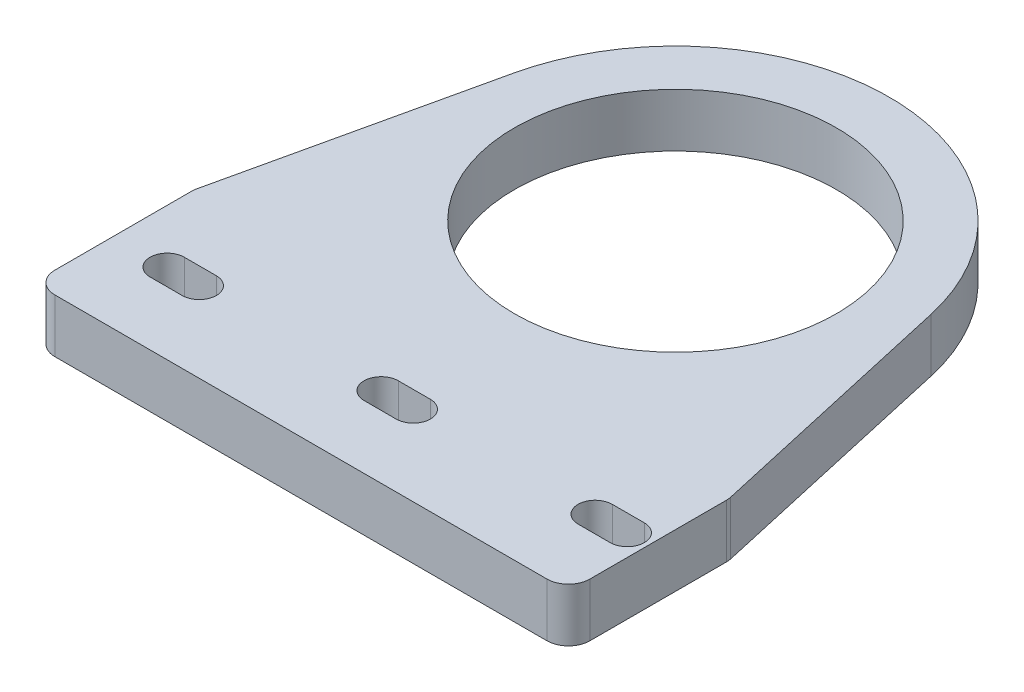
ISO-10303-21;
HEADER;
FILE_DESCRIPTION(('STEP AP214'),'2;1');
FILE_NAME('part.step','',(''),(''),'','','');
FILE_SCHEMA(('AUTOMOTIVE_DESIGN { 1 0 10303 214 1 1 1 1 }'));
ENDSEC;
DATA;
#1=APPLICATION_CONTEXT('core data for automotive mechanical design processes');
#2=APPLICATION_PROTOCOL_DEFINITION('international standard','automotive_design',2000,#1);
#3=PRODUCT_CONTEXT('',#1,'mechanical');
#4=PRODUCT('Part','Part','',(#3));
#5=PRODUCT_RELATED_PRODUCT_CATEGORY('part','',(#4));
#6=PRODUCT_DEFINITION_FORMATION('','',#4);
#7=PRODUCT_DEFINITION_CONTEXT('part definition',#1,'design');
#8=PRODUCT_DEFINITION('design','',#6,#7);
#9=PRODUCT_DEFINITION_SHAPE('','',#8);
#10=(LENGTH_UNIT() NAMED_UNIT(*) SI_UNIT(.MILLI.,.METRE.));
#11=(NAMED_UNIT(*) PLANE_ANGLE_UNIT() SI_UNIT($,.RADIAN.));
#12=(NAMED_UNIT(*) SI_UNIT($,.STERADIAN.) SOLID_ANGLE_UNIT());
#13=UNCERTAINTY_MEASURE_WITH_UNIT(LENGTH_MEASURE(1.E-05),#10,'distance_accuracy_value','');
#14=(GEOMETRIC_REPRESENTATION_CONTEXT(3) GLOBAL_UNCERTAINTY_ASSIGNED_CONTEXT((#13)) GLOBAL_UNIT_ASSIGNED_CONTEXT((#10,
#11,#12)) REPRESENTATION_CONTEXT('',''));
#15=CARTESIAN_POINT('',(0.,0.,0.));
#16=DIRECTION('',(0.,0.,1.));
#17=DIRECTION('',(1.,0.,0.));
#18=AXIS2_PLACEMENT_3D('',#15,#16,#17);
#19=CARTESIAN_POINT('',(-20.,0.,27.5));
#20=DIRECTION('',(0.,1.,0.));
#21=DIRECTION('',(0.,0.,1.));
#22=AXIS2_PLACEMENT_3D('',#19,#20,#21);
#23=CYLINDRICAL_SURFACE('',#22,1.6);
#24=DIRECTION('',(0.,1.,0.));
#25=VECTOR('',#24,1.);
#26=CARTESIAN_POINT('',(-20.,0.,25.9));
#27=LINE('',#26,#25);
#28=CARTESIAN_POINT('',(-20.,0.,25.9));
#29=VERTEX_POINT('',#28);
#30=CARTESIAN_POINT('',(-20.,5.,25.9));
#31=VERTEX_POINT('',#30);
#32=EDGE_CURVE('E244',#29,#31,#27,.T.);
#33=ORIENTED_EDGE('',*,*,#32,.T.);
#34=CARTESIAN_POINT('',(-20.,5.,27.5));
#35=DIRECTION('',(0.,1.,0.));
#36=DIRECTION('',(0.,0.,1.));
#37=AXIS2_PLACEMENT_3D('',#34,#35,#36);
#38=CIRCLE('',#37,1.6);
#39=CARTESIAN_POINT('',(-20.,5.,29.1));
#40=VERTEX_POINT('',#39);
#41=EDGE_CURVE('E334',#31,#40,#38,.T.);
#42=ORIENTED_EDGE('',*,*,#41,.T.);
#43=DIRECTION('',(0.,1.,0.));
#44=VECTOR('',#43,1.);
#45=CARTESIAN_POINT('',(-20.,0.,29.1));
#46=LINE('',#45,#44);
#47=CARTESIAN_POINT('',(-20.,0.,29.1));
#48=VERTEX_POINT('',#47);
#49=EDGE_CURVE('E220',#48,#40,#46,.T.);
#50=ORIENTED_EDGE('',*,*,#49,.F.);
#51=CARTESIAN_POINT('',(-20.,0.,27.5));
#52=DIRECTION('',(0.,1.,0.));
#53=DIRECTION('',(0.,0.,1.));
#54=AXIS2_PLACEMENT_3D('',#51,#52,#53);
#55=CIRCLE('',#54,1.6);
#56=EDGE_CURVE('E234',#29,#48,#55,.T.);
#57=ORIENTED_EDGE('',*,*,#56,.F.);
#58=EDGE_LOOP('',(#33,#42,#50,#57));
#59=FACE_BOUND('',#58,.T.);
#60=ADVANCED_FACE('F65',(#59),#23,.F.);
#61=CARTESIAN_POINT('',(20.,0.,27.5));
#62=DIRECTION('',(0.,1.,0.));
#63=DIRECTION('',(0.,0.,1.));
#64=AXIS2_PLACEMENT_3D('',#61,#62,#63);
#65=CYLINDRICAL_SURFACE('',#64,1.6);
#66=DIRECTION('',(0.,1.,0.));
#67=VECTOR('',#66,1.);
#68=CARTESIAN_POINT('',(20.,0.,25.9));
#69=LINE('',#68,#67);
#70=CARTESIAN_POINT('',(20.,0.,25.9));
#71=VERTEX_POINT('',#70);
#72=CARTESIAN_POINT('',(20.,5.,25.9));
#73=VERTEX_POINT('',#72);
#74=EDGE_CURVE('E283',#71,#73,#69,.T.);
#75=ORIENTED_EDGE('',*,*,#74,.T.);
#76=CARTESIAN_POINT('',(20.,5.,27.5));
#77=DIRECTION('',(0.,1.,0.));
#78=DIRECTION('',(0.,0.,1.));
#79=AXIS2_PLACEMENT_3D('',#76,#77,#78);
#80=CIRCLE('',#79,1.6);
#81=CARTESIAN_POINT('',(20.,5.,29.1));
#82=VERTEX_POINT('',#81);
#83=EDGE_CURVE('E328',#73,#82,#80,.T.);
#84=ORIENTED_EDGE('',*,*,#83,.T.);
#85=DIRECTION('',(0.,1.,0.));
#86=VECTOR('',#85,1.);
#87=CARTESIAN_POINT('',(20.,0.,29.1));
#88=LINE('',#87,#86);
#89=CARTESIAN_POINT('',(20.,0.,29.1));
#90=VERTEX_POINT('',#89);
#91=EDGE_CURVE('E276',#90,#82,#88,.T.);
#92=ORIENTED_EDGE('',*,*,#91,.F.);
#93=CARTESIAN_POINT('',(20.,0.,27.5));
#94=DIRECTION('',(0.,1.,0.));
#95=DIRECTION('',(0.,0.,1.));
#96=AXIS2_PLACEMENT_3D('',#93,#94,#95);
#97=CIRCLE('',#96,1.6);
#98=EDGE_CURVE('E331',#71,#90,#97,.T.);
#99=ORIENTED_EDGE('',*,*,#98,.F.);
#100=EDGE_LOOP('',(#75,#84,#92,#99));
#101=FACE_BOUND('',#100,.T.);
#102=ADVANCED_FACE('F444',(#101),#65,.F.);
#103=CARTESIAN_POINT('',(0.,0.,27.5));
#104=DIRECTION('',(0.,1.,0.));
#105=DIRECTION('',(0.,0.,1.));
#106=AXIS2_PLACEMENT_3D('',#103,#104,#105);
#107=CYLINDRICAL_SURFACE('',#106,1.6);
#108=DIRECTION('',(0.,1.,0.));
#109=VECTOR('',#108,1.);
#110=CARTESIAN_POINT('',(0.,0.,25.9));
#111=LINE('',#110,#109);
#112=CARTESIAN_POINT('',(0.,0.,25.9));
#113=VERTEX_POINT('',#112);
#114=CARTESIAN_POINT('',(0.,5.,25.9));
#115=VERTEX_POINT('',#114);
#116=EDGE_CURVE('E257',#113,#115,#111,.T.);
#117=ORIENTED_EDGE('',*,*,#116,.T.);
#118=CARTESIAN_POINT('',(0.,5.,27.5));
#119=DIRECTION('',(0.,1.,0.));
#120=DIRECTION('',(0.,0.,1.));
#121=AXIS2_PLACEMENT_3D('',#118,#119,#120);
#122=CIRCLE('',#121,1.6);
#123=CARTESIAN_POINT('',(0.,5.,29.1));
#124=VERTEX_POINT('',#123);
#125=EDGE_CURVE('E324',#115,#124,#122,.T.);
#126=ORIENTED_EDGE('',*,*,#125,.T.);
#127=DIRECTION('',(0.,1.,0.));
#128=VECTOR('',#127,1.);
#129=CARTESIAN_POINT('',(0.,0.,29.1));
#130=LINE('',#129,#128);
#131=CARTESIAN_POINT('',(0.,0.,29.1));
#132=VERTEX_POINT('',#131);
#133=EDGE_CURVE('E250',#132,#124,#130,.T.);
#134=ORIENTED_EDGE('',*,*,#133,.F.);
#135=CARTESIAN_POINT('',(0.,0.,27.5));
#136=DIRECTION('',(0.,1.,0.));
#137=DIRECTION('',(0.,0.,1.));
#138=AXIS2_PLACEMENT_3D('',#135,#136,#137);
#139=CIRCLE('',#138,1.6);
#140=EDGE_CURVE('E325',#113,#132,#139,.T.);
#141=ORIENTED_EDGE('',*,*,#140,.F.);
#142=EDGE_LOOP('',(#117,#126,#134,#141));
#143=FACE_BOUND('',#142,.T.);
#144=ADVANCED_FACE('F451',(#143),#107,.F.);
#145=CARTESIAN_POINT('',(-25.,0.,20.));
#146=DIRECTION('',(-1.,0.,0.));
#147=DIRECTION('',(0.,0.,1.));
#148=AXIS2_PLACEMENT_3D('',#145,#146,#147);
#149=PLANE('',#148);
#150=DIRECTION('',(0.,0.,1.));
#151=VECTOR('',#150,1.);
#152=CARTESIAN_POINT('',(-25.,5.,20.));
#153=LINE('',#152,#151);
#154=CARTESIAN_POINT('',(-25.,5.,20.2222222222222));
#155=VERTEX_POINT('',#154);
#156=CARTESIAN_POINT('',(-25.,5.,33.));
#157=VERTEX_POINT('',#156);
#158=EDGE_CURVE('E338',#155,#157,#153,.T.);
#159=ORIENTED_EDGE('',*,*,#158,.F.);
#160=DIRECTION('',(0.,1.,0.));
#161=VECTOR('',#160,1.);
#162=CARTESIAN_POINT('',(-25.,0.,20.2222222222222));
#163=LINE('',#162,#161);
#164=CARTESIAN_POINT('',(-25.,0.,20.2222222222222));
#165=VERTEX_POINT('',#164);
#166=EDGE_CURVE('E372',#155,#165,#163,.F.);
#167=ORIENTED_EDGE('',*,*,#166,.T.);
#168=DIRECTION('',(0.,0.,1.));
#169=VECTOR('',#168,1.);
#170=CARTESIAN_POINT('',(-25.,0.,20.));
#171=LINE('',#170,#169);
#172=CARTESIAN_POINT('',(-25.,0.,33.));
#173=VERTEX_POINT('',#172);
#174=EDGE_CURVE('E341',#165,#173,#171,.T.);
#175=ORIENTED_EDGE('',*,*,#174,.T.);
#176=DIRECTION('',(0.,1.,0.));
#177=VECTOR('',#176,1.);
#178=CARTESIAN_POINT('',(-25.,0.,33.));
#179=LINE('',#178,#177);
#180=EDGE_CURVE('E369',#173,#157,#179,.T.);
#181=ORIENTED_EDGE('',*,*,#180,.T.);
#182=EDGE_LOOP('',(#159,#167,#175,#181));
#183=FACE_BOUND('',#182,.T.);
#184=ADVANCED_FACE('F416',(#183),#149,.T.);
#185=CARTESIAN_POINT('',(25.,0.,20.));
#186=DIRECTION('',(1.,0.,0.));
#187=DIRECTION('',(0.,0.,-1.));
#188=AXIS2_PLACEMENT_3D('',#185,#186,#187);
#189=PLANE('',#188);
#190=DIRECTION('',(0.,0.,-1.));
#191=VECTOR('',#190,1.);
#192=CARTESIAN_POINT('',(25.,0.,20.));
#193=LINE('',#192,#191);
#194=CARTESIAN_POINT('',(25.,0.,33.));
#195=VERTEX_POINT('',#194);
#196=CARTESIAN_POINT('',(25.,0.,20.2222222222222));
#197=VERTEX_POINT('',#196);
#198=EDGE_CURVE('E348',#195,#197,#193,.T.);
#199=ORIENTED_EDGE('',*,*,#198,.T.);
#200=DIRECTION('',(0.,1.,0.));
#201=VECTOR('',#200,1.);
#202=CARTESIAN_POINT('',(25.,0.,20.2222222222222));
#203=LINE('',#202,#201);
#204=CARTESIAN_POINT('',(25.,5.,20.2222222222222));
#205=VERTEX_POINT('',#204);
#206=EDGE_CURVE('E73',#197,#205,#203,.T.);
#207=ORIENTED_EDGE('',*,*,#206,.T.);
#208=DIRECTION('',(0.,0.,-1.));
#209=VECTOR('',#208,1.);
#210=CARTESIAN_POINT('',(25.,5.,20.));
#211=LINE('',#210,#209);
#212=CARTESIAN_POINT('',(25.,5.,33.));
#213=VERTEX_POINT('',#212);
#214=EDGE_CURVE('E345',#213,#205,#211,.T.);
#215=ORIENTED_EDGE('',*,*,#214,.F.);
#216=DIRECTION('',(0.,1.,0.));
#217=VECTOR('',#216,1.);
#218=CARTESIAN_POINT('',(25.,0.,33.));
#219=LINE('',#218,#217);
#220=EDGE_CURVE('E387',#213,#195,#219,.F.);
#221=ORIENTED_EDGE('',*,*,#220,.T.);
#222=EDGE_LOOP('',(#199,#207,#215,#221));
#223=FACE_BOUND('',#222,.T.);
#224=ADVANCED_FACE('F392',(#223),#189,.T.);
#225=CARTESIAN_POINT('',(-25.,0.,35.));
#226=DIRECTION('',(0.,0.,1.));
#227=DIRECTION('',(1.,0.,0.));
#228=AXIS2_PLACEMENT_3D('',#225,#226,#227);
#229=PLANE('',#228);
#230=DIRECTION('',(1.,0.,0.));
#231=VECTOR('',#230,1.);
#232=CARTESIAN_POINT('',(-25.,5.,35.));
#233=LINE('',#232,#231);
#234=CARTESIAN_POINT('',(-23.,5.,35.));
#235=VERTEX_POINT('',#234);
#236=CARTESIAN_POINT('',(23.,5.,35.));
#237=VERTEX_POINT('',#236);
#238=EDGE_CURVE('E354',#235,#237,#233,.T.);
#239=ORIENTED_EDGE('',*,*,#238,.F.);
#240=DIRECTION('',(0.,1.,0.));
#241=VECTOR('',#240,1.);
#242=CARTESIAN_POINT('',(-23.,0.,35.));
#243=LINE('',#242,#241);
#244=CARTESIAN_POINT('',(-23.,0.,35.));
#245=VERTEX_POINT('',#244);
#246=EDGE_CURVE('E385',#235,#245,#243,.F.);
#247=ORIENTED_EDGE('',*,*,#246,.T.);
#248=DIRECTION('',(1.,0.,0.));
#249=VECTOR('',#248,1.);
#250=CARTESIAN_POINT('',(-25.,0.,35.));
#251=LINE('',#250,#249);
#252=CARTESIAN_POINT('',(23.,0.,35.));
#253=VERTEX_POINT('',#252);
#254=EDGE_CURVE('E344',#245,#253,#251,.T.);
#255=ORIENTED_EDGE('',*,*,#254,.T.);
#256=DIRECTION('',(0.,1.,0.));
#257=VECTOR('',#256,1.);
#258=CARTESIAN_POINT('',(23.,0.,35.));
#259=LINE('',#258,#257);
#260=EDGE_CURVE('E382',#253,#237,#259,.T.);
#261=ORIENTED_EDGE('',*,*,#260,.T.);
#262=EDGE_LOOP('',(#239,#247,#255,#261));
#263=FACE_BOUND('',#262,.T.);
#264=ADVANCED_FACE('F406',(#263),#229,.T.);
#265=CARTESIAN_POINT('',(0.,0.,0.));
#266=DIRECTION('',(0.,1.,0.));
#267=DIRECTION('',(0.,0.,1.));
#268=AXIS2_PLACEMENT_3D('',#265,#266,#267);
#269=PLANE('',#268);
#270=CARTESIAN_POINT('',(0.,0.,0.));
#271=DIRECTION('',(0.,1.,0.));
#272=DIRECTION('',(0.,0.,1.));
#273=AXIS2_PLACEMENT_3D('',#270,#271,#272);
#274=CIRCLE('',#273,15.05);
#275=CARTESIAN_POINT('',(0.,0.,15.05));
#276=VERTEX_POINT('',#275);
#277=EDGE_CURVE('E299',#276,#276,#274,.T.);
#278=ORIENTED_EDGE('',*,*,#277,.T.);
#279=EDGE_LOOP('',(#278));
#280=FACE_BOUND('',#279,.T.);
#281=CARTESIAN_POINT('',(3.,0.,27.5));
#282=DIRECTION('',(0.,1.,0.));
#283=DIRECTION('',(0.,0.,1.));
#284=AXIS2_PLACEMENT_3D('',#281,#282,#283);
#285=CIRCLE('',#284,1.6);
#286=CARTESIAN_POINT('',(3.,0.,29.1));
#287=VERTEX_POINT('',#286);
#288=CARTESIAN_POINT('',(3.,0.,25.9));
#289=VERTEX_POINT('',#288);
#290=EDGE_CURVE('E271',#287,#289,#285,.T.);
#291=ORIENTED_EDGE('',*,*,#290,.T.);
#292=DIRECTION('',(-1.,0.,0.));
#293=VECTOR('',#292,1.);
#294=CARTESIAN_POINT('',(0.,0.,25.9));
#295=LINE('',#294,#293);
#296=EDGE_CURVE('E252',#289,#113,#295,.T.);
#297=ORIENTED_EDGE('',*,*,#296,.T.);
#298=ORIENTED_EDGE('',*,*,#140,.T.);
#299=DIRECTION('',(1.,0.,0.));
#300=VECTOR('',#299,1.);
#301=CARTESIAN_POINT('',(0.,0.,29.1));
#302=LINE('',#301,#300);
#303=EDGE_CURVE('E264',#132,#287,#302,.T.);
#304=ORIENTED_EDGE('',*,*,#303,.T.);
#305=EDGE_LOOP('',(#291,#297,#298,#304));
#306=FACE_BOUND('',#305,.T.);
#307=CARTESIAN_POINT('',(23.,0.,27.5));
#308=DIRECTION('',(0.,1.,0.));
#309=DIRECTION('',(0.,0.,1.));
#310=AXIS2_PLACEMENT_3D('',#307,#308,#309);
#311=CIRCLE('',#310,1.6);
#312=CARTESIAN_POINT('',(23.,0.,29.1));
#313=VERTEX_POINT('',#312);
#314=CARTESIAN_POINT('',(23.,0.,25.9));
#315=VERTEX_POINT('',#314);
#316=EDGE_CURVE('E295',#313,#315,#311,.T.);
#317=ORIENTED_EDGE('',*,*,#316,.T.);
#318=DIRECTION('',(-1.,0.,0.));
#319=VECTOR('',#318,1.);
#320=CARTESIAN_POINT('',(20.,0.,25.9));
#321=LINE('',#320,#319);
#322=EDGE_CURVE('E278',#315,#71,#321,.T.);
#323=ORIENTED_EDGE('',*,*,#322,.T.);
#324=ORIENTED_EDGE('',*,*,#98,.T.);
#325=DIRECTION('',(1.,0.,0.));
#326=VECTOR('',#325,1.);
#327=CARTESIAN_POINT('',(20.,0.,29.1));
#328=LINE('',#327,#326);
#329=EDGE_CURVE('E88',#90,#313,#328,.T.);
#330=ORIENTED_EDGE('',*,*,#329,.T.);
#331=EDGE_LOOP('',(#317,#323,#324,#330));
#332=FACE_BOUND('',#331,.T.);
#333=CARTESIAN_POINT('',(-17.,0.,27.5));
#334=DIRECTION('',(0.,1.,0.));
#335=DIRECTION('',(0.,0.,1.));
#336=AXIS2_PLACEMENT_3D('',#333,#334,#335);
#337=CIRCLE('',#336,1.6);
#338=CARTESIAN_POINT('',(-17.,0.,29.1));
#339=VERTEX_POINT('',#338);
#340=CARTESIAN_POINT('',(-17.,0.,25.9));
#341=VERTEX_POINT('',#340);
#342=EDGE_CURVE('E223',#339,#341,#337,.T.);
#343=ORIENTED_EDGE('',*,*,#342,.T.);
#344=DIRECTION('',(-1.,0.,0.));
#345=VECTOR('',#344,1.);
#346=CARTESIAN_POINT('',(-20.,0.,25.9));
#347=LINE('',#346,#345);
#348=EDGE_CURVE('E228',#341,#29,#347,.T.);
#349=ORIENTED_EDGE('',*,*,#348,.T.);
#350=ORIENTED_EDGE('',*,*,#56,.T.);
#351=DIRECTION('',(1.,0.,0.));
#352=VECTOR('',#351,1.);
#353=CARTESIAN_POINT('',(-20.,0.,29.1));
#354=LINE('',#353,#352);
#355=EDGE_CURVE('E80',#48,#339,#354,.T.);
#356=ORIENTED_EDGE('',*,*,#355,.T.);
#357=EDGE_LOOP('',(#343,#349,#350,#356));
#358=FACE_BOUND('',#357,.T.);
#359=ORIENTED_EDGE('',*,*,#174,.F.);
#360=CARTESIAN_POINT('',(-23.,0.,20.2222222222222));
#361=DIRECTION('',(0.,1.,0.));
#362=DIRECTION('',(0.,0.,1.));
#363=AXIS2_PLACEMENT_3D('',#360,#361,#362);
#364=CIRCLE('',#363,2.);
#365=CARTESIAN_POINT('',(-24.9512195121951,0.,19.7831978319783));
#366=VERTEX_POINT('',#365);
#367=EDGE_CURVE('E380',#165,#366,#364,.F.);
#368=ORIENTED_EDGE('',*,*,#367,.T.);
#369=DIRECTION('',(0.219512195121951,0.,-0.975609756097561));
#370=VECTOR('',#369,1.);
#371=CARTESIAN_POINT('',(-19.5121951219512,0.,-4.39024390243902));
#372=LINE('',#371,#370);
#373=CARTESIAN_POINT('',(-19.5121951219512,0.,-4.39024390243902));
#374=VERTEX_POINT('',#373);
#375=EDGE_CURVE('E318',#366,#374,#372,.T.);
#376=ORIENTED_EDGE('',*,*,#375,.T.);
#377=CARTESIAN_POINT('',(0.,0.,0.));
#378=DIRECTION('',(0.,1.,0.));
#379=DIRECTION('',(0.,0.,1.));
#380=AXIS2_PLACEMENT_3D('',#377,#378,#379);
#381=CIRCLE('',#380,20.);
#382=CARTESIAN_POINT('',(19.5121951219512,0.,-4.39024390243903));
#383=VERTEX_POINT('',#382);
#384=EDGE_CURVE('E311',#383,#374,#381,.T.);
#385=ORIENTED_EDGE('',*,*,#384,.F.);
#386=DIRECTION('',(-0.219512195121952,0.,-0.975609756097561));
#387=VECTOR('',#386,1.);
#388=CARTESIAN_POINT('',(19.5121951219512,0.,-4.39024390243903));
#389=LINE('',#388,#387);
#390=CARTESIAN_POINT('',(24.9512195121951,0.,19.7831978319783));
#391=VERTEX_POINT('',#390);
#392=EDGE_CURVE('E305',#391,#383,#389,.T.);
#393=ORIENTED_EDGE('',*,*,#392,.F.);
#394=CARTESIAN_POINT('',(23.,0.,20.2222222222222));
#395=DIRECTION('',(0.,1.,0.));
#396=DIRECTION('',(0.,0.,1.));
#397=AXIS2_PLACEMENT_3D('',#394,#395,#396);
#398=CIRCLE('',#397,2.);
#399=EDGE_CURVE('E376',#391,#197,#398,.F.);
#400=ORIENTED_EDGE('',*,*,#399,.T.);
#401=ORIENTED_EDGE('',*,*,#198,.F.);
#402=CARTESIAN_POINT('',(23.,0.,33.));
#403=DIRECTION('',(0.,1.,0.));
#404=DIRECTION('',(0.,0.,1.));
#405=AXIS2_PLACEMENT_3D('',#402,#403,#404);
#406=CIRCLE('',#405,2.);
#407=EDGE_CURVE('E374',#195,#253,#406,.F.);
#408=ORIENTED_EDGE('',*,*,#407,.T.);
#409=ORIENTED_EDGE('',*,*,#254,.F.);
#410=CARTESIAN_POINT('',(-23.,0.,33.));
#411=DIRECTION('',(0.,1.,0.));
#412=DIRECTION('',(0.,0.,1.));
#413=AXIS2_PLACEMENT_3D('',#410,#411,#412);
#414=CIRCLE('',#413,2.);
#415=EDGE_CURVE('E378',#245,#173,#414,.F.);
#416=ORIENTED_EDGE('',*,*,#415,.T.);
#417=EDGE_LOOP('',(#359,#368,#376,#385,#393,#400,#401,#408,#409,#416));
#418=FACE_BOUND('',#417,.T.);
#419=ADVANCED_FACE('F231',(#280,#306,#332,#358,#418),#269,.F.);
#420=CARTESIAN_POINT('',(0.,5.,0.));
#421=DIRECTION('',(0.,1.,0.));
#422=DIRECTION('',(0.,0.,1.));
#423=AXIS2_PLACEMENT_3D('',#420,#421,#422);
#424=PLANE('',#423);
#425=DIRECTION('',(-1.,0.,0.));
#426=VECTOR('',#425,1.);
#427=CARTESIAN_POINT('',(-20.,5.,25.9));
#428=LINE('',#427,#426);
#429=CARTESIAN_POINT('',(-17.,5.,25.9));
#430=VERTEX_POINT('',#429);
#431=EDGE_CURVE('E235',#430,#31,#428,.T.);
#432=ORIENTED_EDGE('',*,*,#431,.F.);
#433=CARTESIAN_POINT('',(-17.,5.,27.5));
#434=DIRECTION('',(0.,1.,0.));
#435=DIRECTION('',(0.,0.,1.));
#436=AXIS2_PLACEMENT_3D('',#433,#434,#435);
#437=CIRCLE('',#436,1.6);
#438=CARTESIAN_POINT('',(-17.,5.,29.1));
#439=VERTEX_POINT('',#438);
#440=EDGE_CURVE('E237',#439,#430,#437,.T.);
#441=ORIENTED_EDGE('',*,*,#440,.F.);
#442=DIRECTION('',(1.,0.,0.));
#443=VECTOR('',#442,1.);
#444=CARTESIAN_POINT('',(-20.,5.,29.1));
#445=LINE('',#444,#443);
#446=EDGE_CURVE('E215',#40,#439,#445,.T.);
#447=ORIENTED_EDGE('',*,*,#446,.F.);
#448=ORIENTED_EDGE('',*,*,#41,.F.);
#449=EDGE_LOOP('',(#432,#441,#447,#448));
#450=FACE_BOUND('',#449,.T.);
#451=DIRECTION('',(-1.,0.,0.));
#452=VECTOR('',#451,1.);
#453=CARTESIAN_POINT('',(0.,5.,25.9));
#454=LINE('',#453,#452);
#455=CARTESIAN_POINT('',(3.,5.,25.9));
#456=VERTEX_POINT('',#455);
#457=EDGE_CURVE('E261',#456,#115,#454,.T.);
#458=ORIENTED_EDGE('',*,*,#457,.F.);
#459=CARTESIAN_POINT('',(3.,5.,27.5));
#460=DIRECTION('',(0.,1.,0.));
#461=DIRECTION('',(0.,0.,1.));
#462=AXIS2_PLACEMENT_3D('',#459,#460,#461);
#463=CIRCLE('',#462,1.6);
#464=CARTESIAN_POINT('',(3.,5.,29.1));
#465=VERTEX_POINT('',#464);
#466=EDGE_CURVE('E263',#465,#456,#463,.T.);
#467=ORIENTED_EDGE('',*,*,#466,.F.);
#468=DIRECTION('',(1.,0.,0.));
#469=VECTOR('',#468,1.);
#470=CARTESIAN_POINT('',(0.,5.,29.1));
#471=LINE('',#470,#469);
#472=EDGE_CURVE('E242',#124,#465,#471,.T.);
#473=ORIENTED_EDGE('',*,*,#472,.F.);
#474=ORIENTED_EDGE('',*,*,#125,.F.);
#475=EDGE_LOOP('',(#458,#467,#473,#474));
#476=FACE_BOUND('',#475,.T.);
#477=DIRECTION('',(-1.,0.,0.));
#478=VECTOR('',#477,1.);
#479=CARTESIAN_POINT('',(20.,5.,25.9));
#480=LINE('',#479,#478);
#481=CARTESIAN_POINT('',(23.,5.,25.9));
#482=VERTEX_POINT('',#481);
#483=EDGE_CURVE('E286',#482,#73,#480,.T.);
#484=ORIENTED_EDGE('',*,*,#483,.F.);
#485=CARTESIAN_POINT('',(23.,5.,27.5));
#486=DIRECTION('',(0.,1.,0.));
#487=DIRECTION('',(0.,0.,1.));
#488=AXIS2_PLACEMENT_3D('',#485,#486,#487);
#489=CIRCLE('',#488,1.6);
#490=CARTESIAN_POINT('',(23.,5.,29.1));
#491=VERTEX_POINT('',#490);
#492=EDGE_CURVE('E288',#491,#482,#489,.T.);
#493=ORIENTED_EDGE('',*,*,#492,.F.);
#494=DIRECTION('',(1.,0.,0.));
#495=VECTOR('',#494,1.);
#496=CARTESIAN_POINT('',(20.,5.,29.1));
#497=LINE('',#496,#495);
#498=EDGE_CURVE('E260',#82,#491,#497,.T.);
#499=ORIENTED_EDGE('',*,*,#498,.F.);
#500=ORIENTED_EDGE('',*,*,#83,.F.);
#501=EDGE_LOOP('',(#484,#493,#499,#500));
#502=FACE_BOUND('',#501,.T.);
#503=CARTESIAN_POINT('',(0.,5.,0.));
#504=DIRECTION('',(0.,1.,0.));
#505=DIRECTION('',(0.,0.,1.));
#506=AXIS2_PLACEMENT_3D('',#503,#504,#505);
#507=CIRCLE('',#506,15.05);
#508=CARTESIAN_POINT('',(0.,5.,15.05));
#509=VERTEX_POINT('',#508);
#510=EDGE_CURVE('E247',#509,#509,#507,.T.);
#511=ORIENTED_EDGE('',*,*,#510,.F.);
#512=EDGE_LOOP('',(#511));
#513=FACE_BOUND('',#512,.T.);
#514=DIRECTION('',(0.219512195121951,0.,-0.975609756097561));
#515=VECTOR('',#514,1.);
#516=CARTESIAN_POINT('',(-19.5121951219512,5.,-4.39024390243902));
#517=LINE('',#516,#515);
#518=CARTESIAN_POINT('',(-24.9512195121951,5.,19.7831978319783));
#519=VERTEX_POINT('',#518);
#520=CARTESIAN_POINT('',(-19.5121951219512,5.,-4.39024390243902));
#521=VERTEX_POINT('',#520);
#522=EDGE_CURVE('E315',#519,#521,#517,.T.);
#523=ORIENTED_EDGE('',*,*,#522,.F.);
#524=CARTESIAN_POINT('',(-23.,5.,20.2222222222222));
#525=DIRECTION('',(0.,1.,0.));
#526=DIRECTION('',(0.,0.,1.));
#527=AXIS2_PLACEMENT_3D('',#524,#525,#526);
#528=CIRCLE('',#527,2.);
#529=EDGE_CURVE('E367',#519,#155,#528,.T.);
#530=ORIENTED_EDGE('',*,*,#529,.T.);
#531=ORIENTED_EDGE('',*,*,#158,.T.);
#532=CARTESIAN_POINT('',(-23.,5.,33.));
#533=DIRECTION('',(0.,1.,0.));
#534=DIRECTION('',(0.,0.,1.));
#535=AXIS2_PLACEMENT_3D('',#532,#533,#534);
#536=CIRCLE('',#535,2.);
#537=EDGE_CURVE('E365',#157,#235,#536,.T.);
#538=ORIENTED_EDGE('',*,*,#537,.T.);
#539=ORIENTED_EDGE('',*,*,#238,.T.);
#540=CARTESIAN_POINT('',(23.,5.,33.));
#541=DIRECTION('',(0.,1.,0.));
#542=DIRECTION('',(0.,0.,1.));
#543=AXIS2_PLACEMENT_3D('',#540,#541,#542);
#544=CIRCLE('',#543,2.);
#545=EDGE_CURVE('E361',#237,#213,#544,.T.);
#546=ORIENTED_EDGE('',*,*,#545,.T.);
#547=ORIENTED_EDGE('',*,*,#214,.T.);
#548=CARTESIAN_POINT('',(23.,5.,20.2222222222222));
#549=DIRECTION('',(0.,1.,0.));
#550=DIRECTION('',(0.,0.,1.));
#551=AXIS2_PLACEMENT_3D('',#548,#549,#550);
#552=CIRCLE('',#551,2.);
#553=CARTESIAN_POINT('',(24.9512195121951,5.,19.7831978319783));
#554=VERTEX_POINT('',#553);
#555=EDGE_CURVE('E363',#205,#554,#552,.T.);
#556=ORIENTED_EDGE('',*,*,#555,.T.);
#557=DIRECTION('',(-0.219512195121952,0.,-0.975609756097561));
#558=VECTOR('',#557,1.);
#559=CARTESIAN_POINT('',(19.5121951219512,5.,-4.39024390243903));
#560=LINE('',#559,#558);
#561=CARTESIAN_POINT('',(19.5121951219512,5.,-4.39024390243903));
#562=VERTEX_POINT('',#561);
#563=EDGE_CURVE('E302',#554,#562,#560,.T.);
#564=ORIENTED_EDGE('',*,*,#563,.T.);
#565=CARTESIAN_POINT('',(0.,5.,0.));
#566=DIRECTION('',(0.,1.,0.));
#567=DIRECTION('',(0.,0.,1.));
#568=AXIS2_PLACEMENT_3D('',#565,#566,#567);
#569=CIRCLE('',#568,20.);
#570=EDGE_CURVE('E312',#562,#521,#569,.T.);
#571=ORIENTED_EDGE('',*,*,#570,.T.);
#572=EDGE_LOOP('',(#523,#530,#531,#538,#539,#546,#547,#556,#564,#571));
#573=FACE_BOUND('',#572,.T.);
#574=ADVANCED_FACE('F399',(#450,#476,#502,#513,#573),#424,.T.);
#575=CARTESIAN_POINT('',(-19.5121951219512,0.,-4.39024390243902));
#576=DIRECTION('',(0.975609756097561,0.,0.219512195121951));
#577=DIRECTION('',(0.219512195121951,0.,-0.975609756097561));
#578=AXIS2_PLACEMENT_3D('',#575,#576,#577);
#579=PLANE('',#578);
#580=ORIENTED_EDGE('',*,*,#375,.F.);
#581=DIRECTION('',(0.,1.,0.));
#582=VECTOR('',#581,1.);
#583=CARTESIAN_POINT('',(-24.9512195121951,5.,19.7831978319783));
#584=LINE('',#583,#582);
#585=EDGE_CURVE('E351',#366,#519,#584,.T.);
#586=ORIENTED_EDGE('',*,*,#585,.T.);
#587=ORIENTED_EDGE('',*,*,#522,.T.);
#588=DIRECTION('',(0.,1.,0.));
#589=VECTOR('',#588,1.);
#590=CARTESIAN_POINT('',(-19.5121951219512,0.,-4.39024390243902));
#591=LINE('',#590,#589);
#592=EDGE_CURVE('E320',#374,#521,#591,.T.);
#593=ORIENTED_EDGE('',*,*,#592,.F.);
#594=EDGE_LOOP('',(#580,#586,#587,#593));
#595=FACE_BOUND('',#594,.T.);
#596=ADVANCED_FACE('F424',(#595),#579,.F.);
#597=CARTESIAN_POINT('',(0.,5.,0.));
#598=DIRECTION('',(0.,-1.,0.));
#599=DIRECTION('',(0.,0.,-1.));
#600=AXIS2_PLACEMENT_3D('',#597,#598,#599);
#601=CYLINDRICAL_SURFACE('',#600,20.);
#602=ORIENTED_EDGE('',*,*,#570,.F.);
#603=DIRECTION('',(0.,1.,0.));
#604=VECTOR('',#603,1.);
#605=CARTESIAN_POINT('',(19.5121951219512,0.,-4.39024390243903));
#606=LINE('',#605,#604);
#607=EDGE_CURVE('E307',#383,#562,#606,.T.);
#608=ORIENTED_EDGE('',*,*,#607,.F.);
#609=ORIENTED_EDGE('',*,*,#384,.T.);
#610=ORIENTED_EDGE('',*,*,#592,.T.);
#611=EDGE_LOOP('',(#602,#608,#609,#610));
#612=FACE_BOUND('',#611,.T.);
#613=ADVANCED_FACE('F431',(#612),#601,.T.);
#614=CARTESIAN_POINT('',(19.5121951219512,0.,-4.39024390243903));
#615=DIRECTION('',(0.975609756097561,0.,-0.219512195121952));
#616=DIRECTION('',(-0.219512195121952,0.,-0.975609756097561));
#617=AXIS2_PLACEMENT_3D('',#614,#615,#616);
#618=PLANE('',#617);
#619=ORIENTED_EDGE('',*,*,#563,.F.);
#620=DIRECTION('',(0.,1.,0.));
#621=VECTOR('',#620,1.);
#622=CARTESIAN_POINT('',(24.9512195121951,0.,19.7831978319783));
#623=LINE('',#622,#621);
#624=EDGE_CURVE('E12',#554,#391,#623,.F.);
#625=ORIENTED_EDGE('',*,*,#624,.T.);
#626=ORIENTED_EDGE('',*,*,#392,.T.);
#627=ORIENTED_EDGE('',*,*,#607,.T.);
#628=EDGE_LOOP('',(#619,#625,#626,#627));
#629=FACE_BOUND('',#628,.T.);
#630=ADVANCED_FACE('F433',(#629),#618,.T.);
#631=CARTESIAN_POINT('',(-23.,0.,20.2222222222222));
#632=DIRECTION('',(0.,-1.,0.));
#633=DIRECTION('',(0.,0.,-1.));
#634=AXIS2_PLACEMENT_3D('',#631,#632,#633);
#635=CYLINDRICAL_SURFACE('',#634,2.);
#636=ORIENTED_EDGE('',*,*,#367,.F.);
#637=ORIENTED_EDGE('',*,*,#166,.F.);
#638=ORIENTED_EDGE('',*,*,#529,.F.);
#639=ORIENTED_EDGE('',*,*,#585,.F.);
#640=EDGE_LOOP('',(#636,#637,#638,#639));
#641=FACE_BOUND('',#640,.T.);
#642=ADVANCED_FACE('F421',(#641),#635,.T.);
#643=CARTESIAN_POINT('',(-23.,0.,33.));
#644=DIRECTION('',(0.,1.,0.));
#645=DIRECTION('',(0.,0.,1.));
#646=AXIS2_PLACEMENT_3D('',#643,#644,#645);
#647=CYLINDRICAL_SURFACE('',#646,2.);
#648=ORIENTED_EDGE('',*,*,#415,.F.);
#649=ORIENTED_EDGE('',*,*,#246,.F.);
#650=ORIENTED_EDGE('',*,*,#537,.F.);
#651=ORIENTED_EDGE('',*,*,#180,.F.);
#652=EDGE_LOOP('',(#648,#649,#650,#651));
#653=FACE_BOUND('',#652,.T.);
#654=ADVANCED_FACE('F413',(#653),#647,.T.);
#655=CARTESIAN_POINT('',(23.,0.,20.2222222222222));
#656=DIRECTION('',(0.,1.,0.));
#657=DIRECTION('',(0.,0.,1.));
#658=AXIS2_PLACEMENT_3D('',#655,#656,#657);
#659=CYLINDRICAL_SURFACE('',#658,2.);
#660=ORIENTED_EDGE('',*,*,#399,.F.);
#661=ORIENTED_EDGE('',*,*,#624,.F.);
#662=ORIENTED_EDGE('',*,*,#555,.F.);
#663=ORIENTED_EDGE('',*,*,#206,.F.);
#664=EDGE_LOOP('',(#660,#661,#662,#663));
#665=FACE_BOUND('',#664,.T.);
#666=ADVANCED_FACE('F435',(#665),#659,.T.);
#667=CARTESIAN_POINT('',(23.,0.,33.));
#668=DIRECTION('',(0.,1.,0.));
#669=DIRECTION('',(0.,0.,1.));
#670=AXIS2_PLACEMENT_3D('',#667,#668,#669);
#671=CYLINDRICAL_SURFACE('',#670,2.);
#672=ORIENTED_EDGE('',*,*,#407,.F.);
#673=ORIENTED_EDGE('',*,*,#220,.F.);
#674=ORIENTED_EDGE('',*,*,#545,.F.);
#675=ORIENTED_EDGE('',*,*,#260,.F.);
#676=EDGE_LOOP('',(#672,#673,#674,#675));
#677=FACE_BOUND('',#676,.T.);
#678=ADVANCED_FACE('F67',(#677),#671,.T.);
#679=CARTESIAN_POINT('',(0.,0.,0.));
#680=DIRECTION('',(0.,1.,0.));
#681=DIRECTION('',(0.,0.,1.));
#682=AXIS2_PLACEMENT_3D('',#679,#680,#681);
#683=CYLINDRICAL_SURFACE('',#682,15.05);
#684=ORIENTED_EDGE('',*,*,#277,.F.);
#685=EDGE_LOOP('',(#684));
#686=FACE_BOUND('',#685,.T.);
#687=ORIENTED_EDGE('',*,*,#510,.T.);
#688=EDGE_LOOP('',(#687));
#689=FACE_BOUND('',#688,.T.);
#690=ADVANCED_FACE('F441',(#686,#689),#683,.F.);
#691=CARTESIAN_POINT('',(0.,0.,25.9));
#692=DIRECTION('',(0.,0.,-1.));
#693=DIRECTION('',(-1.,0.,0.));
#694=AXIS2_PLACEMENT_3D('',#691,#692,#693);
#695=PLANE('',#694);
#696=ORIENTED_EDGE('',*,*,#457,.T.);
#697=ORIENTED_EDGE('',*,*,#116,.F.);
#698=ORIENTED_EDGE('',*,*,#296,.F.);
#699=DIRECTION('',(0.,1.,0.));
#700=VECTOR('',#699,1.);
#701=CARTESIAN_POINT('',(3.,0.,25.9));
#702=LINE('',#701,#700);
#703=EDGE_CURVE('E255',#289,#456,#702,.T.);
#704=ORIENTED_EDGE('',*,*,#703,.T.);
#705=EDGE_LOOP('',(#696,#697,#698,#704));
#706=FACE_BOUND('',#705,.T.);
#707=ADVANCED_FACE('F500',(#706),#695,.F.);
#708=CARTESIAN_POINT('',(3.,0.,27.5));
#709=DIRECTION('',(0.,1.,0.));
#710=DIRECTION('',(0.,0.,1.));
#711=AXIS2_PLACEMENT_3D('',#708,#709,#710);
#712=CYLINDRICAL_SURFACE('',#711,1.6);
#713=ORIENTED_EDGE('',*,*,#466,.T.);
#714=ORIENTED_EDGE('',*,*,#703,.F.);
#715=ORIENTED_EDGE('',*,*,#290,.F.);
#716=DIRECTION('',(0.,1.,0.));
#717=VECTOR('',#716,1.);
#718=CARTESIAN_POINT('',(3.,0.,29.1));
#719=LINE('',#718,#717);
#720=EDGE_CURVE('E253',#287,#465,#719,.T.);
#721=ORIENTED_EDGE('',*,*,#720,.T.);
#722=EDGE_LOOP('',(#713,#714,#715,#721));
#723=FACE_BOUND('',#722,.T.);
#724=ADVANCED_FACE('F502',(#723),#712,.F.);
#725=CARTESIAN_POINT('',(0.,0.,29.1));
#726=DIRECTION('',(0.,0.,1.));
#727=DIRECTION('',(1.,0.,0.));
#728=AXIS2_PLACEMENT_3D('',#725,#726,#727);
#729=PLANE('',#728);
#730=ORIENTED_EDGE('',*,*,#472,.T.);
#731=ORIENTED_EDGE('',*,*,#720,.F.);
#732=ORIENTED_EDGE('',*,*,#303,.F.);
#733=ORIENTED_EDGE('',*,*,#133,.T.);
#734=EDGE_LOOP('',(#730,#731,#732,#733));
#735=FACE_BOUND('',#734,.T.);
#736=ADVANCED_FACE('F496',(#735),#729,.F.);
#737=CARTESIAN_POINT('',(20.,0.,25.9));
#738=DIRECTION('',(0.,0.,-1.));
#739=DIRECTION('',(-1.,0.,0.));
#740=AXIS2_PLACEMENT_3D('',#737,#738,#739);
#741=PLANE('',#740);
#742=ORIENTED_EDGE('',*,*,#483,.T.);
#743=ORIENTED_EDGE('',*,*,#74,.F.);
#744=ORIENTED_EDGE('',*,*,#322,.F.);
#745=DIRECTION('',(0.,1.,0.));
#746=VECTOR('',#745,1.);
#747=CARTESIAN_POINT('',(23.,0.,25.9));
#748=LINE('',#747,#746);
#749=EDGE_CURVE('E281',#315,#482,#748,.T.);
#750=ORIENTED_EDGE('',*,*,#749,.T.);
#751=EDGE_LOOP('',(#742,#743,#744,#750));
#752=FACE_BOUND('',#751,.T.);
#753=ADVANCED_FACE('F509',(#752),#741,.F.);
#754=CARTESIAN_POINT('',(23.,0.,27.5));
#755=DIRECTION('',(0.,1.,0.));
#756=DIRECTION('',(0.,0.,1.));
#757=AXIS2_PLACEMENT_3D('',#754,#755,#756);
#758=CYLINDRICAL_SURFACE('',#757,1.6);
#759=ORIENTED_EDGE('',*,*,#492,.T.);
#760=ORIENTED_EDGE('',*,*,#749,.F.);
#761=ORIENTED_EDGE('',*,*,#316,.F.);
#762=DIRECTION('',(0.,1.,0.));
#763=VECTOR('',#762,1.);
#764=CARTESIAN_POINT('',(23.,0.,29.1));
#765=LINE('',#764,#763);
#766=EDGE_CURVE('E279',#313,#491,#765,.T.);
#767=ORIENTED_EDGE('',*,*,#766,.T.);
#768=EDGE_LOOP('',(#759,#760,#761,#767));
#769=FACE_BOUND('',#768,.T.);
#770=ADVANCED_FACE('F518',(#769),#758,.F.);
#771=CARTESIAN_POINT('',(20.,0.,29.1));
#772=DIRECTION('',(0.,0.,1.));
#773=DIRECTION('',(1.,0.,0.));
#774=AXIS2_PLACEMENT_3D('',#771,#772,#773);
#775=PLANE('',#774);
#776=ORIENTED_EDGE('',*,*,#498,.T.);
#777=ORIENTED_EDGE('',*,*,#766,.F.);
#778=ORIENTED_EDGE('',*,*,#329,.F.);
#779=ORIENTED_EDGE('',*,*,#91,.T.);
#780=EDGE_LOOP('',(#776,#777,#778,#779));
#781=FACE_BOUND('',#780,.T.);
#782=ADVANCED_FACE('F514',(#781),#775,.F.);
#783=CARTESIAN_POINT('',(-20.,0.,25.9));
#784=DIRECTION('',(0.,0.,-1.));
#785=DIRECTION('',(-1.,0.,0.));
#786=AXIS2_PLACEMENT_3D('',#783,#784,#785);
#787=PLANE('',#786);
#788=ORIENTED_EDGE('',*,*,#431,.T.);
#789=ORIENTED_EDGE('',*,*,#32,.F.);
#790=ORIENTED_EDGE('',*,*,#348,.F.);
#791=DIRECTION('',(0.,1.,0.));
#792=VECTOR('',#791,1.);
#793=CARTESIAN_POINT('',(-17.,0.,25.9));
#794=LINE('',#793,#792);
#795=EDGE_CURVE('E219',#341,#430,#794,.T.);
#796=ORIENTED_EDGE('',*,*,#795,.T.);
#797=EDGE_LOOP('',(#788,#789,#790,#796));
#798=FACE_BOUND('',#797,.T.);
#799=ADVANCED_FACE('F517',(#798),#787,.F.);
#800=CARTESIAN_POINT('',(-17.,0.,27.5));
#801=DIRECTION('',(0.,1.,0.));
#802=DIRECTION('',(0.,0.,1.));
#803=AXIS2_PLACEMENT_3D('',#800,#801,#802);
#804=CYLINDRICAL_SURFACE('',#803,1.6);
#805=ORIENTED_EDGE('',*,*,#440,.T.);
#806=ORIENTED_EDGE('',*,*,#795,.F.);
#807=ORIENTED_EDGE('',*,*,#342,.F.);
#808=DIRECTION('',(0.,1.,0.));
#809=VECTOR('',#808,1.);
#810=CARTESIAN_POINT('',(-17.,0.,29.1));
#811=LINE('',#810,#809);
#812=EDGE_CURVE('E211',#339,#439,#811,.T.);
#813=ORIENTED_EDGE('',*,*,#812,.T.);
#814=EDGE_LOOP('',(#805,#806,#807,#813));
#815=FACE_BOUND('',#814,.T.);
#816=ADVANCED_FACE('F224',(#815),#804,.F.);
#817=CARTESIAN_POINT('',(-20.,0.,29.1));
#818=DIRECTION('',(0.,0.,1.));
#819=DIRECTION('',(1.,0.,0.));
#820=AXIS2_PLACEMENT_3D('',#817,#818,#819);
#821=PLANE('',#820);
#822=ORIENTED_EDGE('',*,*,#446,.T.);
#823=ORIENTED_EDGE('',*,*,#812,.F.);
#824=ORIENTED_EDGE('',*,*,#355,.F.);
#825=ORIENTED_EDGE('',*,*,#49,.T.);
#826=EDGE_LOOP('',(#822,#823,#824,#825));
#827=FACE_BOUND('',#826,.T.);
#828=ADVANCED_FACE('F213',(#827),#821,.F.);
#829=CLOSED_SHELL('',(#60,#102,#144,#184,#224,#264,#419,#574,#596,#613,#630,#642,#654,#666,#678,
#690,#707,#724,#736,#753,#770,#782,#799,#816,#828));
#830=MANIFOLD_SOLID_BREP('B2',#829);
#831=ADVANCED_BREP_SHAPE_REPRESENTATION('',(#18,#830),#14);
#832=SHAPE_DEFINITION_REPRESENTATION(#9,#831);
ENDSEC;
END-ISO-10303-21;
